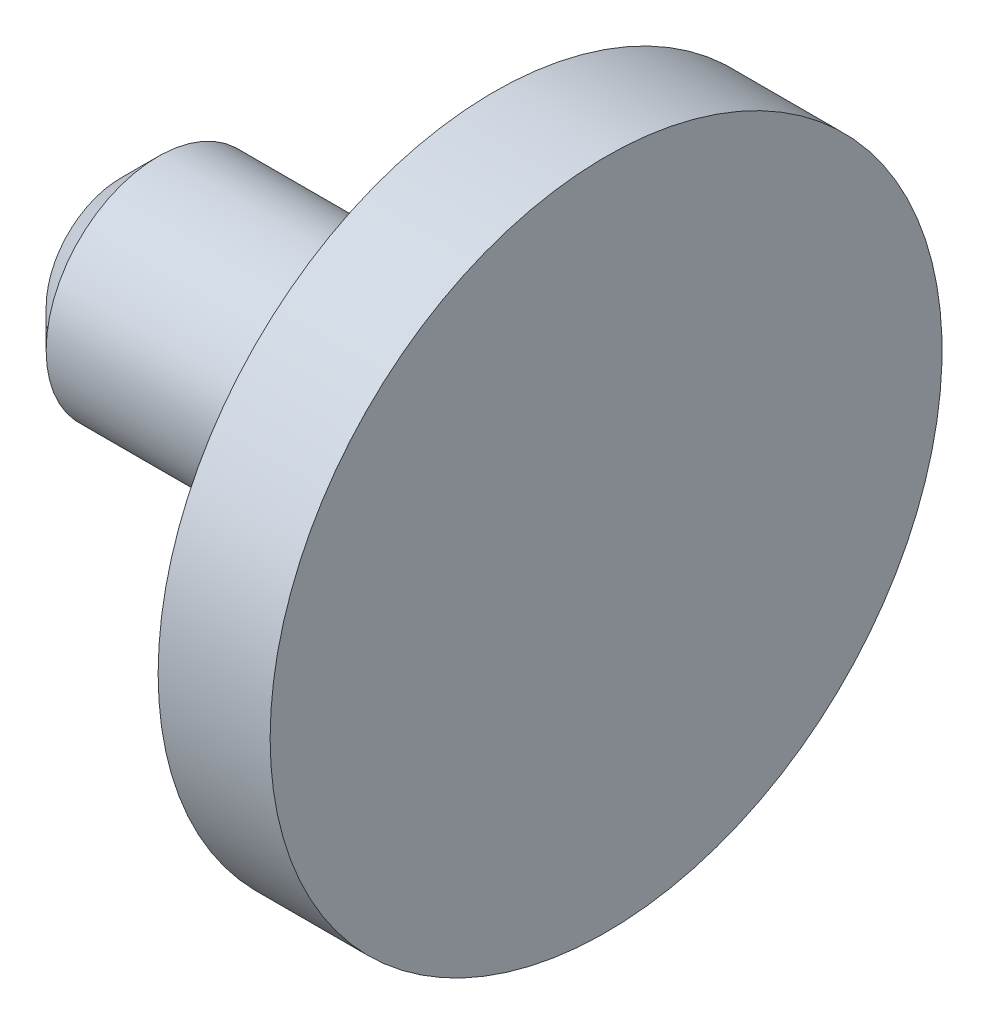
ISO-10303-21;
HEADER;
FILE_DESCRIPTION(('STEP AP214'),'2;1');
FILE_NAME('part.step','',(''),(''),'','','');
FILE_SCHEMA(('AUTOMOTIVE_DESIGN { 1 0 10303 214 1 1 1 1 }'));
ENDSEC;
DATA;
#1=APPLICATION_CONTEXT('core data for automotive mechanical design processes');
#2=APPLICATION_PROTOCOL_DEFINITION('international standard','automotive_design',2000,#1);
#3=PRODUCT_CONTEXT('',#1,'mechanical');
#4=PRODUCT('Part','Part','',(#3));
#5=PRODUCT_RELATED_PRODUCT_CATEGORY('part','',(#4));
#6=PRODUCT_DEFINITION_FORMATION('','',#4);
#7=PRODUCT_DEFINITION_CONTEXT('part definition',#1,'design');
#8=PRODUCT_DEFINITION('design','',#6,#7);
#9=PRODUCT_DEFINITION_SHAPE('','',#8);
#10=(LENGTH_UNIT() NAMED_UNIT(*) SI_UNIT(.MILLI.,.METRE.));
#11=(NAMED_UNIT(*) PLANE_ANGLE_UNIT() SI_UNIT($,.RADIAN.));
#12=(NAMED_UNIT(*) SI_UNIT($,.STERADIAN.) SOLID_ANGLE_UNIT());
#13=UNCERTAINTY_MEASURE_WITH_UNIT(LENGTH_MEASURE(1.E-05),#10,'distance_accuracy_value','');
#14=(GEOMETRIC_REPRESENTATION_CONTEXT(3) GLOBAL_UNCERTAINTY_ASSIGNED_CONTEXT((#13)) GLOBAL_UNIT_ASSIGNED_CONTEXT((#10,
#11,#12)) REPRESENTATION_CONTEXT('',''));
#15=CARTESIAN_POINT('',(0.,0.,0.));
#16=DIRECTION('',(0.,0.,1.));
#17=DIRECTION('',(1.,0.,0.));
#18=AXIS2_PLACEMENT_3D('',#15,#16,#17);
#19=CARTESIAN_POINT('',(13.,0.,0.));
#20=DIRECTION('',(-1.,0.,0.));
#21=DIRECTION('',(0.,0.,1.));
#22=AXIS2_PLACEMENT_3D('',#19,#20,#21);
#23=PLANE('',#22);
#24=CARTESIAN_POINT('',(13.,0.,0.));
#25=DIRECTION('',(-1.,0.,0.));
#26=DIRECTION('',(0.,0.,1.));
#27=AXIS2_PLACEMENT_3D('',#24,#25,#26);
#28=CIRCLE('',#27,9.);
#29=CARTESIAN_POINT('',(13.,0.,9.));
#30=VERTEX_POINT('',#29);
#31=EDGE_CURVE('E10',#30,#30,#28,.T.);
#32=ORIENTED_EDGE('',*,*,#31,.F.);
#33=EDGE_LOOP('',(#32));
#34=FACE_BOUND('',#33,.T.);
#35=ADVANCED_FACE('F31',(#34),#23,.F.);
#36=CARTESIAN_POINT('',(0.,0.,0.));
#37=DIRECTION('',(-1.,0.,0.));
#38=DIRECTION('',(0.,0.,1.));
#39=AXIS2_PLACEMENT_3D('',#36,#37,#38);
#40=CYLINDRICAL_SURFACE('',#39,9.);
#41=CARTESIAN_POINT('',(10.,0.,0.));
#42=DIRECTION('',(-1.,0.,0.));
#43=DIRECTION('',(0.,0.,1.));
#44=AXIS2_PLACEMENT_3D('',#41,#42,#43);
#45=CIRCLE('',#44,9.);
#46=CARTESIAN_POINT('',(10.,0.,9.));
#47=VERTEX_POINT('',#46);
#48=EDGE_CURVE('E37',#47,#47,#45,.T.);
#49=ORIENTED_EDGE('',*,*,#48,.F.);
#50=EDGE_LOOP('',(#49));
#51=FACE_BOUND('',#50,.T.);
#52=ORIENTED_EDGE('',*,*,#31,.T.);
#53=EDGE_LOOP('',(#52));
#54=FACE_BOUND('',#53,.T.);
#55=ADVANCED_FACE('F70',(#51,#54),#40,.T.);
#56=CARTESIAN_POINT('',(10.,3.,0.));
#57=DIRECTION('',(1.,0.,0.));
#58=DIRECTION('',(0.,0.,-1.));
#59=AXIS2_PLACEMENT_3D('',#56,#57,#58);
#60=PLANE('',#59);
#61=CARTESIAN_POINT('',(10.,0.,0.));
#62=DIRECTION('',(-1.,0.,0.));
#63=DIRECTION('',(0.,0.,1.));
#64=AXIS2_PLACEMENT_3D('',#61,#62,#63);
#65=CIRCLE('',#64,3.);
#66=CARTESIAN_POINT('',(10.,0.,3.));
#67=VERTEX_POINT('',#66);
#68=EDGE_CURVE('E41',#67,#67,#65,.T.);
#69=ORIENTED_EDGE('',*,*,#68,.F.);
#70=EDGE_LOOP('',(#69));
#71=FACE_BOUND('',#70,.T.);
#72=ORIENTED_EDGE('',*,*,#48,.T.);
#73=EDGE_LOOP('',(#72));
#74=FACE_BOUND('',#73,.T.);
#75=ADVANCED_FACE('F65',(#71,#74),#60,.F.);
#76=CARTESIAN_POINT('',(0.,0.,0.));
#77=DIRECTION('',(-1.,0.,0.));
#78=DIRECTION('',(0.,0.,1.));
#79=AXIS2_PLACEMENT_3D('',#76,#77,#78);
#80=CYLINDRICAL_SURFACE('',#79,3.);
#81=CARTESIAN_POINT('',(1.,0.,0.));
#82=DIRECTION('',(-1.,0.,0.));
#83=DIRECTION('',(0.,0.,1.));
#84=AXIS2_PLACEMENT_3D('',#81,#82,#83);
#85=CIRCLE('',#84,3.);
#86=CARTESIAN_POINT('',(1.,0.,3.));
#87=VERTEX_POINT('',#86);
#88=EDGE_CURVE('E45',#87,#87,#85,.T.);
#89=ORIENTED_EDGE('',*,*,#88,.F.);
#90=EDGE_LOOP('',(#89));
#91=FACE_BOUND('',#90,.T.);
#92=ORIENTED_EDGE('',*,*,#68,.T.);
#93=EDGE_LOOP('',(#92));
#94=FACE_BOUND('',#93,.T.);
#95=ADVANCED_FACE('F59',(#91,#94),#80,.T.);
#96=CARTESIAN_POINT('',(1.,0.,0.));
#97=DIRECTION('',(1.,0.,0.));
#98=DIRECTION('',(0.,0.,-1.));
#99=AXIS2_PLACEMENT_3D('',#96,#97,#98);
#100=CONICAL_SURFACE('',#99,3.,0.78539816339745);
#101=CARTESIAN_POINT('',(0.,0.,0.));
#102=DIRECTION('',(-1.,0.,0.));
#103=DIRECTION('',(0.,0.,1.));
#104=AXIS2_PLACEMENT_3D('',#101,#102,#103);
#105=CIRCLE('',#104,2.);
#106=CARTESIAN_POINT('',(0.,0.,2.));
#107=VERTEX_POINT('',#106);
#108=EDGE_CURVE('E50',#107,#107,#105,.T.);
#109=ORIENTED_EDGE('',*,*,#108,.F.);
#110=EDGE_LOOP('',(#109));
#111=FACE_BOUND('',#110,.T.);
#112=ORIENTED_EDGE('',*,*,#88,.T.);
#113=EDGE_LOOP('',(#112));
#114=FACE_BOUND('',#113,.T.);
#115=ADVANCED_FACE('F56',(#111,#114),#100,.T.);
#116=CARTESIAN_POINT('',(0.,0.,0.));
#117=DIRECTION('',(1.,0.,0.));
#118=DIRECTION('',(0.,0.,-1.));
#119=AXIS2_PLACEMENT_3D('',#116,#117,#118);
#120=PLANE('',#119);
#121=ORIENTED_EDGE('',*,*,#108,.T.);
#122=EDGE_LOOP('',(#121));
#123=FACE_BOUND('',#122,.T.);
#124=ADVANCED_FACE('F54',(#123),#120,.F.);
#125=CLOSED_SHELL('',(#35,#55,#75,#95,#115,#124));
#126=MANIFOLD_SOLID_BREP('B2',#125);
#127=ADVANCED_BREP_SHAPE_REPRESENTATION('',(#18,#126),#14);
#128=SHAPE_DEFINITION_REPRESENTATION(#9,#127);
ENDSEC;
END-ISO-10303-21;
